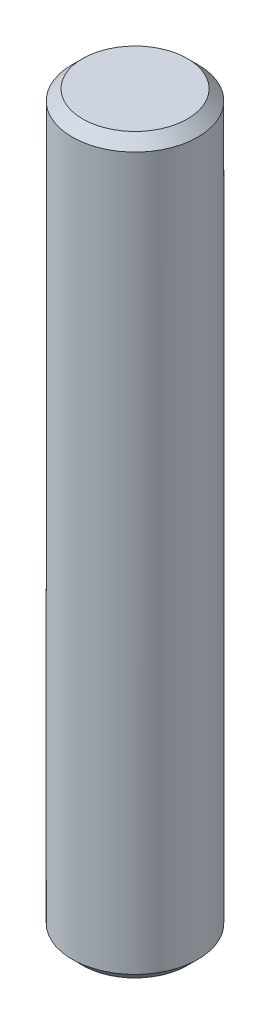
ISO-10303-21;
HEADER;
FILE_DESCRIPTION(('STEP AP214'),'2;1');
FILE_NAME('part.step','',(''),(''),'','','');
FILE_SCHEMA(('AUTOMOTIVE_DESIGN { 1 0 10303 214 1 1 1 1 }'));
ENDSEC;
DATA;
#1=APPLICATION_CONTEXT('core data for automotive mechanical design processes');
#2=APPLICATION_PROTOCOL_DEFINITION('international standard','automotive_design',2000,#1);
#3=PRODUCT_CONTEXT('',#1,'mechanical');
#4=PRODUCT('Part','Part','',(#3));
#5=PRODUCT_RELATED_PRODUCT_CATEGORY('part','',(#4));
#6=PRODUCT_DEFINITION_FORMATION('','',#4);
#7=PRODUCT_DEFINITION_CONTEXT('part definition',#1,'design');
#8=PRODUCT_DEFINITION('design','',#6,#7);
#9=PRODUCT_DEFINITION_SHAPE('','',#8);
#10=(LENGTH_UNIT() NAMED_UNIT(*) SI_UNIT(.MILLI.,.METRE.));
#11=(NAMED_UNIT(*) PLANE_ANGLE_UNIT() SI_UNIT($,.RADIAN.));
#12=(NAMED_UNIT(*) SI_UNIT($,.STERADIAN.) SOLID_ANGLE_UNIT());
#13=UNCERTAINTY_MEASURE_WITH_UNIT(LENGTH_MEASURE(1.E-05),#10,'distance_accuracy_value','');
#14=(GEOMETRIC_REPRESENTATION_CONTEXT(3) GLOBAL_UNCERTAINTY_ASSIGNED_CONTEXT((#13)) GLOBAL_UNIT_ASSIGNED_CONTEXT((#10,
#11,#12)) REPRESENTATION_CONTEXT('',''));
#15=CARTESIAN_POINT('',(0.,0.,0.));
#16=DIRECTION('',(0.,0.,1.));
#17=DIRECTION('',(1.,0.,0.));
#18=AXIS2_PLACEMENT_3D('',#15,#16,#17);
#19=CARTESIAN_POINT('',(0.,70.,0.));
#20=DIRECTION('',(0.,1.,0.));
#21=DIRECTION('',(0.,0.,1.));
#22=AXIS2_PLACEMENT_3D('',#19,#20,#21);
#23=PLANE('',#22);
#24=CARTESIAN_POINT('',(0.,70.,0.));
#25=DIRECTION('',(0.,1.,0.));
#26=DIRECTION('',(0.,0.,1.));
#27=AXIS2_PLACEMENT_3D('',#24,#25,#26);
#28=CIRCLE('',#27,4.99999999999999);
#29=CARTESIAN_POINT('',(0.,70.,4.99999999999999));
#30=VERTEX_POINT('',#29);
#31=EDGE_CURVE('E10',#30,#30,#28,.T.);
#32=ORIENTED_EDGE('',*,*,#31,.T.);
#33=EDGE_LOOP('',(#32));
#34=FACE_BOUND('',#33,.T.);
#35=ADVANCED_FACE('F34',(#34),#23,.T.);
#36=CARTESIAN_POINT('',(0.,0.,0.));
#37=DIRECTION('',(0.,-1.,0.));
#38=DIRECTION('',(0.,0.,-1.));
#39=AXIS2_PLACEMENT_3D('',#36,#37,#38);
#40=CYLINDRICAL_SURFACE('',#39,6.);
#41=CARTESIAN_POINT('',(0.,1.00000000000001,0.));
#42=DIRECTION('',(0.,-1.,0.));
#43=DIRECTION('',(0.,0.,-1.));
#44=AXIS2_PLACEMENT_3D('',#41,#42,#43);
#45=CIRCLE('',#44,6.);
#46=CARTESIAN_POINT('',(0.,1.00000000000001,-6.));
#47=VERTEX_POINT('',#46);
#48=EDGE_CURVE('E41',#47,#47,#45,.F.);
#49=ORIENTED_EDGE('',*,*,#48,.T.);
#50=EDGE_LOOP('',(#49));
#51=FACE_BOUND('',#50,.T.);
#52=CARTESIAN_POINT('',(0.,69.,0.));
#53=DIRECTION('',(0.,1.,0.));
#54=DIRECTION('',(0.,0.,1.));
#55=AXIS2_PLACEMENT_3D('',#52,#53,#54);
#56=CIRCLE('',#55,6.);
#57=CARTESIAN_POINT('',(0.,69.,6.));
#58=VERTEX_POINT('',#57);
#59=EDGE_CURVE('E45',#58,#58,#56,.F.);
#60=ORIENTED_EDGE('',*,*,#59,.T.);
#61=EDGE_LOOP('',(#60));
#62=FACE_BOUND('',#61,.T.);
#63=ADVANCED_FACE('F65',(#51,#62),#40,.T.);
#64=CARTESIAN_POINT('',(0.,0.,0.));
#65=DIRECTION('',(0.,-1.,0.));
#66=DIRECTION('',(0.,0.,-1.));
#67=AXIS2_PLACEMENT_3D('',#64,#65,#66);
#68=PLANE('',#67);
#69=CARTESIAN_POINT('',(0.,0.,0.));
#70=DIRECTION('',(0.,-1.,0.));
#71=DIRECTION('',(0.,0.,-1.));
#72=AXIS2_PLACEMENT_3D('',#69,#70,#71);
#73=CIRCLE('',#72,4.99999999999999);
#74=CARTESIAN_POINT('',(0.,0.,-4.99999999999999));
#75=VERTEX_POINT('',#74);
#76=EDGE_CURVE('E49',#75,#75,#73,.T.);
#77=ORIENTED_EDGE('',*,*,#76,.T.);
#78=EDGE_LOOP('',(#77));
#79=FACE_BOUND('',#78,.T.);
#80=ADVANCED_FACE('F55',(#79),#68,.T.);
#81=CARTESIAN_POINT('',(0.,0.,0.));
#82=DIRECTION('',(0.,1.,0.));
#83=DIRECTION('',(0.,0.,1.));
#84=AXIS2_PLACEMENT_3D('',#81,#82,#83);
#85=CONICAL_SURFACE('',#84,4.99999999999999,0.785398163397448);
#86=ORIENTED_EDGE('',*,*,#48,.F.);
#87=EDGE_LOOP('',(#86));
#88=FACE_BOUND('',#87,.T.);
#89=ORIENTED_EDGE('',*,*,#76,.F.);
#90=EDGE_LOOP('',(#89));
#91=FACE_BOUND('',#90,.T.);
#92=ADVANCED_FACE('F57',(#88,#91),#85,.T.);
#93=CARTESIAN_POINT('',(0.,69.,0.));
#94=DIRECTION('',(0.,-1.,0.));
#95=DIRECTION('',(0.,0.,-1.));
#96=AXIS2_PLACEMENT_3D('',#93,#94,#95);
#97=CONICAL_SURFACE('',#96,6.,0.785398163397445);
#98=ORIENTED_EDGE('',*,*,#31,.F.);
#99=EDGE_LOOP('',(#98));
#100=FACE_BOUND('',#99,.T.);
#101=ORIENTED_EDGE('',*,*,#59,.F.);
#102=EDGE_LOOP('',(#101));
#103=FACE_BOUND('',#102,.T.);
#104=ADVANCED_FACE('F36',(#100,#103),#97,.T.);
#105=CLOSED_SHELL('',(#35,#63,#80,#92,#104));
#106=MANIFOLD_SOLID_BREP('B2',#105);
#107=ADVANCED_BREP_SHAPE_REPRESENTATION('',(#18,#106),#14);
#108=SHAPE_DEFINITION_REPRESENTATION(#9,#107);
ENDSEC;
END-ISO-10303-21;
